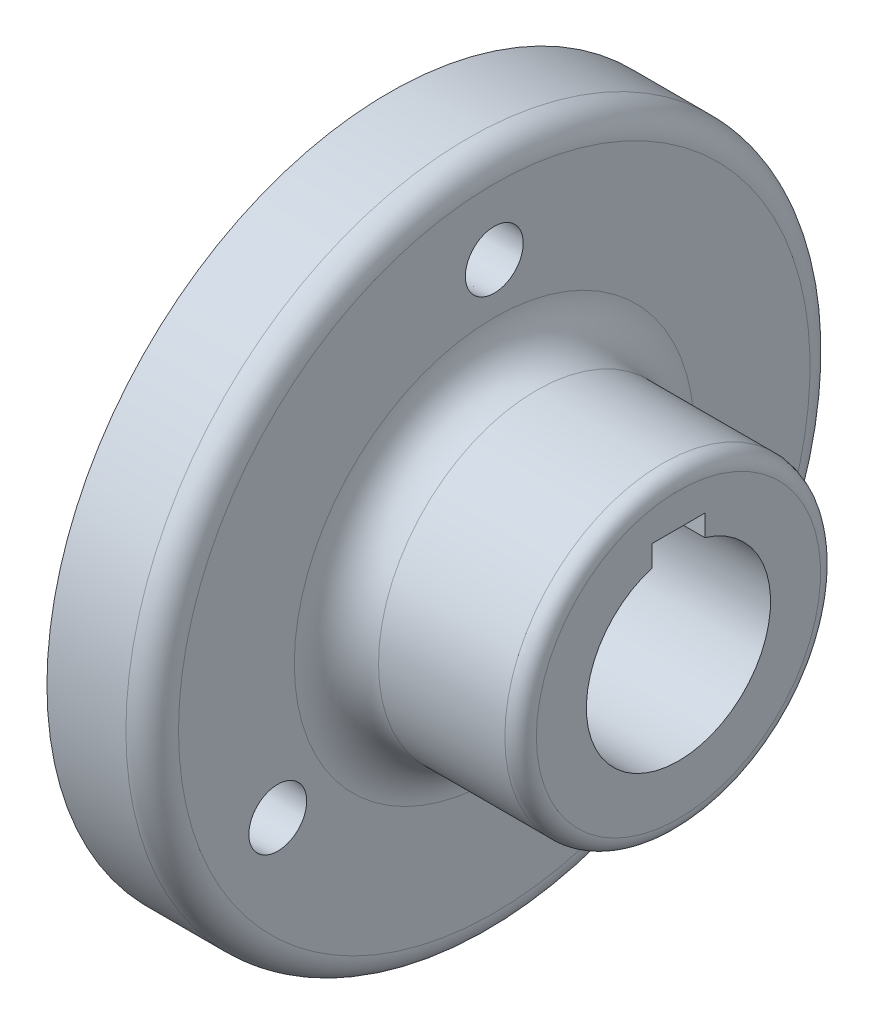
ISO-10303-21;
HEADER;
FILE_DESCRIPTION(('STEP AP214'),'2;1');
FILE_NAME('part.step','',(''),(''),'','','');
FILE_SCHEMA(('AUTOMOTIVE_DESIGN { 1 0 10303 214 1 1 1 1 }'));
ENDSEC;
DATA;
#1=APPLICATION_CONTEXT('core data for automotive mechanical design processes');
#2=APPLICATION_PROTOCOL_DEFINITION('international standard','automotive_design',2000,#1);
#3=PRODUCT_CONTEXT('',#1,'mechanical');
#4=PRODUCT('Part','Part','',(#3));
#5=PRODUCT_RELATED_PRODUCT_CATEGORY('part','',(#4));
#6=PRODUCT_DEFINITION_FORMATION('','',#4);
#7=PRODUCT_DEFINITION_CONTEXT('part definition',#1,'design');
#8=PRODUCT_DEFINITION('design','',#6,#7);
#9=PRODUCT_DEFINITION_SHAPE('','',#8);
#10=(LENGTH_UNIT() NAMED_UNIT(*) SI_UNIT(.MILLI.,.METRE.));
#11=(NAMED_UNIT(*) PLANE_ANGLE_UNIT() SI_UNIT($,.RADIAN.));
#12=(NAMED_UNIT(*) SI_UNIT($,.STERADIAN.) SOLID_ANGLE_UNIT());
#13=UNCERTAINTY_MEASURE_WITH_UNIT(LENGTH_MEASURE(1.E-05),#10,'distance_accuracy_value','');
#14=(GEOMETRIC_REPRESENTATION_CONTEXT(3) GLOBAL_UNCERTAINTY_ASSIGNED_CONTEXT((#13)) GLOBAL_UNIT_ASSIGNED_CONTEXT((#10,
#11,#12)) REPRESENTATION_CONTEXT('',''));
#15=CARTESIAN_POINT('',(0.,0.,0.));
#16=DIRECTION('',(0.,0.,1.));
#17=DIRECTION('',(1.,0.,0.));
#18=AXIS2_PLACEMENT_3D('',#15,#16,#17);
#19=CARTESIAN_POINT('',(-55.,0.,0.));
#20=DIRECTION('',(-1.,0.,0.));
#21=DIRECTION('',(0.,0.,1.));
#22=AXIS2_PLACEMENT_3D('',#19,#20,#21);
#23=CYLINDRICAL_SURFACE('',#22,65.);
#24=CARTESIAN_POINT('',(0.,0.,0.));
#25=DIRECTION('',(1.,0.,0.));
#26=DIRECTION('',(0.,0.,-1.));
#27=AXIS2_PLACEMENT_3D('',#24,#25,#26);
#28=CIRCLE('',#27,65.);
#29=CARTESIAN_POINT('',(0.,0.,-65.));
#30=VERTEX_POINT('',#29);
#31=EDGE_CURVE('E105',#30,#30,#28,.T.);
#32=ORIENTED_EDGE('',*,*,#31,.T.);
#33=EDGE_LOOP('',(#32));
#34=FACE_BOUND('',#33,.T.);
#35=CARTESIAN_POINT('',(15.,0.,0.));
#36=DIRECTION('',(-1.,0.,0.));
#37=DIRECTION('',(0.,0.,1.));
#38=AXIS2_PLACEMENT_3D('',#35,#36,#37);
#39=CIRCLE('',#38,65.);
#40=CARTESIAN_POINT('',(15.,0.,65.));
#41=VERTEX_POINT('',#40);
#42=EDGE_CURVE('E115',#41,#41,#39,.T.);
#43=ORIENTED_EDGE('',*,*,#42,.T.);
#44=EDGE_LOOP('',(#43));
#45=FACE_BOUND('',#44,.T.);
#46=ADVANCED_FACE('F36',(#34,#45),#23,.T.);
#47=CARTESIAN_POINT('',(0.,0.,0.));
#48=DIRECTION('',(-1.,0.,0.));
#49=DIRECTION('',(0.,0.,1.));
#50=AXIS2_PLACEMENT_3D('',#47,#48,#49);
#51=CYLINDRICAL_SURFACE('',#50,17.5);
#52=DIRECTION('',(-1.,0.,0.));
#53=VECTOR('',#52,1.);
#54=CARTESIAN_POINT('',(0.,16.7705098312484,-5.));
#55=LINE('',#54,#53);
#56=CARTESIAN_POINT('',(55.,16.7705098312484,-5.));
#57=VERTEX_POINT('',#56);
#58=CARTESIAN_POINT('',(0.,16.7705098312484,-5.));
#59=VERTEX_POINT('',#58);
#60=EDGE_CURVE('E11',#57,#59,#55,.T.);
#61=ORIENTED_EDGE('',*,*,#60,.T.);
#62=CARTESIAN_POINT('',(0.,0.,0.));
#63=DIRECTION('',(1.,0.,0.));
#64=DIRECTION('',(0.,0.,-1.));
#65=AXIS2_PLACEMENT_3D('',#62,#63,#64);
#66=CIRCLE('',#65,17.5);
#67=CARTESIAN_POINT('',(0.,16.7705098312484,5.));
#68=VERTEX_POINT('',#67);
#69=EDGE_CURVE('E156',#59,#68,#66,.F.);
#70=ORIENTED_EDGE('',*,*,#69,.T.);
#71=DIRECTION('',(-1.,0.,0.));
#72=VECTOR('',#71,1.);
#73=CARTESIAN_POINT('',(0.,16.7705098312484,5.));
#74=LINE('',#73,#72);
#75=CARTESIAN_POINT('',(55.,16.7705098312484,5.));
#76=VERTEX_POINT('',#75);
#77=EDGE_CURVE('E43',#68,#76,#74,.F.);
#78=ORIENTED_EDGE('',*,*,#77,.T.);
#79=CARTESIAN_POINT('',(55.,0.,0.));
#80=DIRECTION('',(-1.,0.,0.));
#81=DIRECTION('',(0.,0.,1.));
#82=AXIS2_PLACEMENT_3D('',#79,#80,#81);
#83=CIRCLE('',#82,17.5);
#84=EDGE_CURVE('E158',#57,#76,#83,.T.);
#85=ORIENTED_EDGE('',*,*,#84,.F.);
#86=EDGE_LOOP('',(#61,#70,#78,#85));
#87=FACE_BOUND('',#86,.T.);
#88=ADVANCED_FACE('F149',(#87),#51,.F.);
#89=CARTESIAN_POINT('',(-55.,14.2,-5.));
#90=DIRECTION('',(0.,0.,-1.));
#91=DIRECTION('',(-1.,0.,0.));
#92=AXIS2_PLACEMENT_3D('',#89,#90,#91);
#93=PLANE('',#92);
#94=DIRECTION('',(1.,0.,0.));
#95=VECTOR('',#94,1.);
#96=CARTESIAN_POINT('',(-55.,20.8,-5.));
#97=LINE('',#96,#95);
#98=CARTESIAN_POINT('',(0.,20.8,-5.));
#99=VERTEX_POINT('',#98);
#100=CARTESIAN_POINT('',(55.,20.8,-5.));
#101=VERTEX_POINT('',#100);
#102=EDGE_CURVE('E93',#99,#101,#97,.T.);
#103=ORIENTED_EDGE('',*,*,#102,.F.);
#104=DIRECTION('',(0.,-1.,0.));
#105=VECTOR('',#104,1.);
#106=CARTESIAN_POINT('',(0.,14.2,-5.));
#107=LINE('',#106,#105);
#108=EDGE_CURVE('E50',#99,#59,#107,.T.);
#109=ORIENTED_EDGE('',*,*,#108,.T.);
#110=ORIENTED_EDGE('',*,*,#60,.F.);
#111=DIRECTION('',(0.,1.,0.));
#112=VECTOR('',#111,1.);
#113=CARTESIAN_POINT('',(55.,14.2,-5.));
#114=LINE('',#113,#112);
#115=EDGE_CURVE('E161',#57,#101,#114,.T.);
#116=ORIENTED_EDGE('',*,*,#115,.T.);
#117=EDGE_LOOP('',(#103,#109,#110,#116));
#118=FACE_BOUND('',#117,.T.);
#119=ADVANCED_FACE('F145',(#118),#93,.F.);
#120=CARTESIAN_POINT('',(-55.,14.2,5.));
#121=DIRECTION('',(0.,0.,1.));
#122=DIRECTION('',(1.,0.,0.));
#123=AXIS2_PLACEMENT_3D('',#120,#121,#122);
#124=PLANE('',#123);
#125=ORIENTED_EDGE('',*,*,#77,.F.);
#126=DIRECTION('',(0.,1.,0.));
#127=VECTOR('',#126,1.);
#128=CARTESIAN_POINT('',(0.,14.2,5.));
#129=LINE('',#128,#127);
#130=CARTESIAN_POINT('',(0.,20.8,5.));
#131=VERTEX_POINT('',#130);
#132=EDGE_CURVE('E78',#68,#131,#129,.T.);
#133=ORIENTED_EDGE('',*,*,#132,.T.);
#134=DIRECTION('',(1.,0.,0.));
#135=VECTOR('',#134,1.);
#136=CARTESIAN_POINT('',(-55.,20.8,5.));
#137=LINE('',#136,#135);
#138=CARTESIAN_POINT('',(55.,20.8,5.));
#139=VERTEX_POINT('',#138);
#140=EDGE_CURVE('E86',#131,#139,#137,.T.);
#141=ORIENTED_EDGE('',*,*,#140,.T.);
#142=DIRECTION('',(0.,-1.,0.));
#143=VECTOR('',#142,1.);
#144=CARTESIAN_POINT('',(55.,14.2,5.));
#145=LINE('',#144,#143);
#146=EDGE_CURVE('E164',#139,#76,#145,.T.);
#147=ORIENTED_EDGE('',*,*,#146,.T.);
#148=EDGE_LOOP('',(#125,#133,#141,#147));
#149=FACE_BOUND('',#148,.T.);
#150=ADVANCED_FACE('F85',(#149),#124,.F.);
#151=CARTESIAN_POINT('',(-55.,20.8,5.));
#152=DIRECTION('',(0.,1.,0.));
#153=DIRECTION('',(0.,0.,1.));
#154=AXIS2_PLACEMENT_3D('',#151,#152,#153);
#155=PLANE('',#154);
#156=ORIENTED_EDGE('',*,*,#140,.F.);
#157=DIRECTION('',(0.,0.,-1.));
#158=VECTOR('',#157,1.);
#159=CARTESIAN_POINT('',(0.,20.8,5.));
#160=LINE('',#159,#158);
#161=EDGE_CURVE('E74',#131,#99,#160,.T.);
#162=ORIENTED_EDGE('',*,*,#161,.T.);
#163=ORIENTED_EDGE('',*,*,#102,.T.);
#164=DIRECTION('',(0.,0.,1.));
#165=VECTOR('',#164,1.);
#166=CARTESIAN_POINT('',(55.,20.8,5.));
#167=LINE('',#166,#165);
#168=EDGE_CURVE('E91',#101,#139,#167,.T.);
#169=ORIENTED_EDGE('',*,*,#168,.T.);
#170=EDGE_LOOP('',(#156,#162,#163,#169));
#171=FACE_BOUND('',#170,.T.);
#172=ADVANCED_FACE('F89',(#171),#155,.F.);
#173=CARTESIAN_POINT('',(55.,27.,0.));
#174=DIRECTION('',(-1.,0.,0.));
#175=DIRECTION('',(0.,0.,-1.));
#176=AXIS2_PLACEMENT_3D('',#173,#174,#175);
#177=PLANE('',#176);
#178=ORIENTED_EDGE('',*,*,#84,.T.);
#179=ORIENTED_EDGE('',*,*,#146,.F.);
#180=ORIENTED_EDGE('',*,*,#168,.F.);
#181=ORIENTED_EDGE('',*,*,#115,.F.);
#182=EDGE_LOOP('',(#178,#179,#180,#181));
#183=FACE_BOUND('',#182,.T.);
#184=CARTESIAN_POINT('',(55.,0.,0.));
#185=DIRECTION('',(-1.,0.,0.));
#186=DIRECTION('',(0.,0.,1.));
#187=AXIS2_PLACEMENT_3D('',#184,#185,#186);
#188=CIRCLE('',#187,27.);
#189=CARTESIAN_POINT('',(55.,0.,27.));
#190=VERTEX_POINT('',#189);
#191=EDGE_CURVE('E172',#190,#190,#188,.T.);
#192=ORIENTED_EDGE('',*,*,#191,.F.);
#193=EDGE_LOOP('',(#192));
#194=FACE_BOUND('',#193,.T.);
#195=ADVANCED_FACE('F138',(#183,#194),#177,.F.);
#196=CARTESIAN_POINT('',(15.,0.,0.));
#197=DIRECTION('',(1.,0.,0.));
#198=DIRECTION('',(0.,0.,1.));
#199=AXIS2_PLACEMENT_3D('',#196,#197,#198);
#200=TOROIDAL_SURFACE('',#199,60.,5.);
#201=CARTESIAN_POINT('',(20.,0.,0.));
#202=DIRECTION('',(-1.,0.,0.));
#203=DIRECTION('',(0.,0.,1.));
#204=AXIS2_PLACEMENT_3D('',#201,#202,#203);
#205=CIRCLE('',#204,60.);
#206=CARTESIAN_POINT('',(20.,0.,60.));
#207=VERTEX_POINT('',#206);
#208=EDGE_CURVE('E183',#207,#207,#205,.T.);
#209=ORIENTED_EDGE('',*,*,#208,.T.);
#210=EDGE_LOOP('',(#209));
#211=FACE_BOUND('',#210,.T.);
#212=ORIENTED_EDGE('',*,*,#42,.F.);
#213=EDGE_LOOP('',(#212));
#214=FACE_BOUND('',#213,.T.);
#215=ADVANCED_FACE('F134',(#211,#214),#200,.T.);
#216=CARTESIAN_POINT('',(20.,60.,0.));
#217=DIRECTION('',(-1.,0.,0.));
#218=DIRECTION('',(0.,0.,-1.));
#219=AXIS2_PLACEMENT_3D('',#216,#217,#218);
#220=PLANE('',#219);
#221=CARTESIAN_POINT('',(20.,-23.7500000000018,41.1362066797578));
#222=DIRECTION('',(1.,0.,0.));
#223=DIRECTION('',(0.,0.,-1.));
#224=AXIS2_PLACEMENT_3D('',#221,#222,#223);
#225=CIRCLE('',#224,5.50005382290806);
#226=CARTESIAN_POINT('',(20.,-23.7500000000018,35.6361528568497));
#227=VERTEX_POINT('',#226);
#228=EDGE_CURVE('E98',#227,#227,#225,.T.);
#229=ORIENTED_EDGE('',*,*,#228,.F.);
#230=EDGE_LOOP('',(#229));
#231=FACE_BOUND('',#230,.T.);
#232=CARTESIAN_POINT('',(20.,-23.7499999999982,-41.1362066797639));
#233=DIRECTION('',(1.,0.,0.));
#234=DIRECTION('',(0.,0.,-1.));
#235=AXIS2_PLACEMENT_3D('',#232,#233,#234);
#236=CIRCLE('',#235,5.50005382290684);
#237=CARTESIAN_POINT('',(20.,-23.7499999999982,-46.6362605026707));
#238=VERTEX_POINT('',#237);
#239=EDGE_CURVE('E102',#238,#238,#236,.T.);
#240=ORIENTED_EDGE('',*,*,#239,.F.);
#241=EDGE_LOOP('',(#240));
#242=FACE_BOUND('',#241,.T.);
#243=CARTESIAN_POINT('',(20.,47.5,0.));
#244=DIRECTION('',(1.,0.,0.));
#245=DIRECTION('',(0.,0.,-1.));
#246=AXIS2_PLACEMENT_3D('',#243,#244,#245);
#247=CIRCLE('',#246,5.50005382290423);
#248=CARTESIAN_POINT('',(20.,47.5,-5.50005382290423));
#249=VERTEX_POINT('',#248);
#250=EDGE_CURVE('E101',#249,#249,#247,.T.);
#251=ORIENTED_EDGE('',*,*,#250,.F.);
#252=EDGE_LOOP('',(#251));
#253=FACE_BOUND('',#252,.T.);
#254=CARTESIAN_POINT('',(20.,0.,0.));
#255=DIRECTION('',(-1.,0.,0.));
#256=DIRECTION('',(0.,0.,1.));
#257=AXIS2_PLACEMENT_3D('',#254,#255,#256);
#258=CIRCLE('',#257,38.);
#259=CARTESIAN_POINT('',(20.,0.,38.));
#260=VERTEX_POINT('',#259);
#261=EDGE_CURVE('E181',#260,#260,#258,.T.);
#262=ORIENTED_EDGE('',*,*,#261,.T.);
#263=EDGE_LOOP('',(#262));
#264=FACE_BOUND('',#263,.T.);
#265=ORIENTED_EDGE('',*,*,#208,.F.);
#266=EDGE_LOOP('',(#265));
#267=FACE_BOUND('',#266,.T.);
#268=ADVANCED_FACE('F130',(#231,#242,#253,#264,#267),#220,.F.);
#269=CARTESIAN_POINT('',(28.,0.,0.));
#270=DIRECTION('',(1.,0.,0.));
#271=DIRECTION('',(0.,0.,1.));
#272=AXIS2_PLACEMENT_3D('',#269,#270,#271);
#273=TOROIDAL_SURFACE('',#272,38.,8.);
#274=CARTESIAN_POINT('',(28.,0.,0.));
#275=DIRECTION('',(-1.,0.,0.));
#276=DIRECTION('',(0.,0.,1.));
#277=AXIS2_PLACEMENT_3D('',#274,#275,#276);
#278=CIRCLE('',#277,30.);
#279=CARTESIAN_POINT('',(28.,0.,30.));
#280=VERTEX_POINT('',#279);
#281=EDGE_CURVE('E178',#280,#280,#278,.T.);
#282=ORIENTED_EDGE('',*,*,#281,.T.);
#283=EDGE_LOOP('',(#282));
#284=FACE_BOUND('',#283,.T.);
#285=ORIENTED_EDGE('',*,*,#261,.F.);
#286=EDGE_LOOP('',(#285));
#287=FACE_BOUND('',#286,.T.);
#288=ADVANCED_FACE('F126',(#284,#287),#273,.F.);
#289=CARTESIAN_POINT('',(55.,0.,0.));
#290=DIRECTION('',(1.,0.,0.));
#291=DIRECTION('',(0.,0.,1.));
#292=AXIS2_PLACEMENT_3D('',#289,#290,#291);
#293=CYLINDRICAL_SURFACE('',#292,30.);
#294=CARTESIAN_POINT('',(40.2297724794524,-29.732137494637,-4.00000000000001));
#295=CARTESIAN_POINT('',(40.4533801903887,-29.7321408902408,-3.99999057189578));
#296=CARTESIAN_POINT('',(40.6771245456852,-29.7346872928155,-3.98118653408272));
#297=CARTESIAN_POINT('',(41.1183774041239,-29.7445929719378,-3.90647592532245));
#298=CARTESIAN_POINT('',(41.3358792892868,-29.7519571726567,-3.85053139298222));
#299=CARTESIAN_POINT('',(41.7581952159052,-29.7706498429081,-3.70322622280533));
#300=CARTESIAN_POINT('',(41.9630181026879,-29.7819755112418,-3.61189060550091));
#301=CARTESIAN_POINT('',(42.3543946308716,-29.8073116450363,-3.39645129761372));
#302=CARTESIAN_POINT('',(42.5409511973285,-29.8213216795734,-3.27235286526938));
#303=CARTESIAN_POINT('',(42.8917193887894,-29.8505475464148,-2.99406740979036));
#304=CARTESIAN_POINT('',(43.0557982108112,-29.8657697698747,-2.83971364549719));
#305=CARTESIAN_POINT('',(43.3558049703652,-29.8956475251647,-2.50565845745221));
#306=CARTESIAN_POINT('',(43.4917314624048,-29.9103030278649,-2.32595573294397));
#307=CARTESIAN_POINT('',(43.7320561628853,-29.9374619952073,-1.94546344985523));
#308=CARTESIAN_POINT('',(43.8363334580329,-29.9499571300455,-1.74459687542245));
#309=CARTESIAN_POINT('',(44.0096248078141,-29.9713170683162,-1.32800763207473));
#310=CARTESIAN_POINT('',(44.0786403442078,-29.9801820242919,-1.1122855878448));
#311=CARTESIAN_POINT('',(44.179050298613,-29.9932377239122,-0.673470750028178));
#312=CARTESIAN_POINT('',(44.2106661094764,-29.9974559641015,-0.450429446939794));
#313=CARTESIAN_POINT('',(44.2360656969261,-30.0008369594303,-0.00217000460731181));
#314=CARTESIAN_POINT('',(44.2298511549255,-29.9999999392566,0.223048037444933));
#315=CARTESIAN_POINT('',(44.1799430183706,-29.9933868823381,0.66776024893154));
#316=CARTESIAN_POINT('',(44.1364875499612,-29.9876422267562,0.887281674723571));
#317=CARTESIAN_POINT('',(44.0137038254094,-29.9718944818458,1.31588824542511));
#318=CARTESIAN_POINT('',(43.9343748091162,-29.9618913022807,1.52497316908368));
#319=CARTESIAN_POINT('',(43.7418455972088,-29.9386963800833,1.92750361684826));
#320=CARTESIAN_POINT('',(43.6285432330863,-29.9254950429176,2.12089969870652));
#321=CARTESIAN_POINT('',(43.3713579648867,-29.8973790083808,2.48602338146957));
#322=CARTESIAN_POINT('',(43.2274734661968,-29.8824642216858,2.65774985173364));
#323=CARTESIAN_POINT('',(42.9118767827346,-29.8524517619132,2.97606012309078));
#324=CARTESIAN_POINT('',(42.7399569430652,-29.837353568488,3.12243806706043));
#325=CARTESIAN_POINT('',(42.3738806167073,-29.8087899753847,3.38429386114383));
#326=CARTESIAN_POINT('',(42.1797240418465,-29.7953245821815,3.49977158872707));
#327=CARTESIAN_POINT('',(41.7744924787591,-29.7715515266868,3.69656572173001));
#328=CARTESIAN_POINT('',(41.5634086704155,-29.7612455242957,3.77786417813414));
#329=CARTESIAN_POINT('',(41.1304164381757,-29.7449895093144,3.90380180089849));
#330=CARTESIAN_POINT('',(40.9085086113993,-29.7390392567232,3.94844298708287));
#331=CARTESIAN_POINT('',(40.4619898094425,-29.7322129002069,3.99952321537455));
#332=CARTESIAN_POINT('',(40.2374126187874,-29.7312982302326,4.00625262197625));
#333=CARTESIAN_POINT('',(39.790333967243,-29.734544485934,3.98208576377592));
#334=CARTESIAN_POINT('',(39.5678324559735,-29.738705288095,3.95119041459553));
#335=CARTESIAN_POINT('',(39.1321005066412,-29.7515984087354,3.8528961007404));
#336=CARTESIAN_POINT('',(38.9188374934162,-29.760312955753,3.7856390064672));
#337=CARTESIAN_POINT('',(38.5066146525476,-29.7813171802881,3.61667690160251));
#338=CARTESIAN_POINT('',(38.307655392805,-29.7936069996568,3.51497052418766));
#339=CARTESIAN_POINT('',(37.9283778585708,-29.8204689323904,3.27928812834422));
#340=CARTESIAN_POINT('',(37.748178382716,-29.8350542757827,3.14512246332601));
#341=CARTESIAN_POINT('',(37.4127506025783,-29.8648228703302,2.84859664625598));
#342=CARTESIAN_POINT('',(37.2575234071564,-29.8800061479987,2.68623524287508));
#343=CARTESIAN_POINT('',(36.9754193716102,-29.9093789731066,2.33665509671648));
#344=CARTESIAN_POINT('',(36.8487338467092,-29.9235614009943,2.14928128186505));
#345=CARTESIAN_POINT('',(36.6286359151018,-29.9492268295661,1.75574490463524));
#346=CARTESIAN_POINT('',(36.5352227599402,-29.9607098909698,1.5495827650274));
#347=CARTESIAN_POINT('',(36.3846339562762,-29.9796512938231,1.12494554504687));
#348=CARTESIAN_POINT('',(36.3273496212853,-29.9871216964156,0.906509568494723));
#349=CARTESIAN_POINT('',(36.2502915085305,-29.9972463337324,0.463012986846395));
#350=CARTESIAN_POINT('',(36.230515794037,-29.9999008171227,0.237952724399643));
#351=CARTESIAN_POINT('',(36.2290759449718,-30.0000929449682,-0.210539747423174));
#352=CARTESIAN_POINT('',(36.2471175382636,-29.9976700982679,-0.433971051843747));
#353=CARTESIAN_POINT('',(36.3201745619164,-29.9880586643979,-0.874594886104723));
#354=CARTESIAN_POINT('',(36.3751899404952,-29.9808700839026,-1.09178742468215));
#355=CARTESIAN_POINT('',(36.5205365736057,-29.9625311328469,-1.51371646917767));
#356=CARTESIAN_POINT('',(36.6108517322681,-29.9513825681572,-1.71845860308763));
#357=CARTESIAN_POINT('',(36.8242035787443,-29.9263549879288,-2.10992815726196));
#358=CARTESIAN_POINT('',(36.9472408707589,-29.9124759219737,-2.29665524479908));
#359=CARTESIAN_POINT('',(37.2236258434581,-29.8834058241629,-2.64829457213272));
#360=CARTESIAN_POINT('',(37.3771920597249,-29.8682058058701,-2.81303431432518));
#361=CARTESIAN_POINT('',(37.7098186175531,-29.8382772980635,-3.11451791174715));
#362=CARTESIAN_POINT('',(37.8888849673172,-29.8235489206796,-3.25125515061516));
#363=CARTESIAN_POINT('',(38.2683403625753,-29.7961621972205,-3.49337581956155));
#364=CARTESIAN_POINT('',(38.4688196623964,-29.7835132334187,-3.59861880854683));
#365=CARTESIAN_POINT('',(38.88466941441,-29.7618273299481,-3.77379036559425));
#366=CARTESIAN_POINT('',(39.1000236189516,-29.7527865201032,-3.84375679331906));
#367=CARTESIAN_POINT('',(39.4686690369136,-29.7415026767313,-3.92990960757651));
#368=CARTESIAN_POINT('',(39.6196490253914,-29.7380085724299,-3.95615496271737));
#369=CARTESIAN_POINT('',(39.9236554983907,-29.7333248295038,-3.99120330686232));
#370=CARTESIAN_POINT('',(40.0766819642464,-29.7321351698749,-4.00000645484598));
#371=CARTESIAN_POINT('',(40.2297724794524,-29.732137494637,-4.00000000000001));
#372=B_SPLINE_CURVE_WITH_KNOTS('',3,(#294,#295,#296,#297,#298,#299,#300,#301,#302,#303,#304,
#305,#306,#307,#308,#309,#310,#311,#312,#313,#314,#315,#316,#317,#318,#319,#320,#321,#322,#323,
#324,#325,#326,#327,#328,#329,#330,#331,#332,#333,#334,#335,#336,#337,#338,#339,#340,#341,#342,
#343,#344,#345,#346,#347,#348,#349,#350,#351,#352,#353,#354,#355,#356,#357,#358,#359,#360,#361,
#362,#363,#364,#365,#366,#367,#368,#369,#370,#371),.UNSPECIFIED.,.T.,.F.,(4,2,2,2,2,2,2,2,2,2,2,
2,2,2,2,2,2,2,2,2,2,2,2,2,2,2,2,2,2,2,2,2,2,2,2,2,2,2,4),(0.,0.670263778500898,1.34121369221137,
2.0116901255365,2.68205901669913,3.35623190242331,4.03043939524477,4.70719113050294,
5.38391442513856,6.05661139049938,6.72927845729714,7.39767617339906,8.06608805333359,
8.73653056912504,9.40700805169258,10.0826983013792,10.7583912303818,11.4344385531148,
12.110448622982,12.7812740516386,13.4520831556709,14.1202936963719,14.7885307523642,
15.4607705628467,16.1330402150124,16.8096902352901,17.4863250335031,18.1609144754067,
18.835469084443,19.504794197126,20.1741183724129,20.8431377070039,21.5121693956216,
22.1861748473789,22.8603393681881,23.5374668396544,24.2138660462919,24.6727588189122,
25.1316474088673),.UNSPECIFIED.);
#373=CARTESIAN_POINT('',(40.2297724794524,-29.732137494637,-4.00000000000001));
#374=VERTEX_POINT('',#373);
#375=EDGE_CURVE('E95',#374,#374,#372,.T.);
#376=ORIENTED_EDGE('',*,*,#375,.F.);
#377=EDGE_LOOP('',(#376));
#378=FACE_BOUND('',#377,.T.);
#379=CARTESIAN_POINT('',(52.,0.,0.));
#380=DIRECTION('',(-1.,0.,0.));
#381=DIRECTION('',(0.,0.,1.));
#382=AXIS2_PLACEMENT_3D('',#379,#380,#381);
#383=CIRCLE('',#382,30.);
#384=CARTESIAN_POINT('',(52.,0.,30.));
#385=VERTEX_POINT('',#384);
#386=EDGE_CURVE('E175',#385,#385,#383,.T.);
#387=ORIENTED_EDGE('',*,*,#386,.T.);
#388=EDGE_LOOP('',(#387));
#389=FACE_BOUND('',#388,.T.);
#390=ORIENTED_EDGE('',*,*,#281,.F.);
#391=EDGE_LOOP('',(#390));
#392=FACE_BOUND('',#391,.T.);
#393=ADVANCED_FACE('F121',(#378,#389,#392),#293,.T.);
#394=CARTESIAN_POINT('',(52.,0.,0.));
#395=DIRECTION('',(1.,0.,0.));
#396=DIRECTION('',(0.,0.,1.));
#397=AXIS2_PLACEMENT_3D('',#394,#395,#396);
#398=TOROIDAL_SURFACE('',#397,27.,3.);
#399=ORIENTED_EDGE('',*,*,#191,.T.);
#400=EDGE_LOOP('',(#399));
#401=FACE_BOUND('',#400,.T.);
#402=ORIENTED_EDGE('',*,*,#386,.F.);
#403=EDGE_LOOP('',(#402));
#404=FACE_BOUND('',#403,.T.);
#405=ADVANCED_FACE('F125',(#401,#404),#398,.T.);
#406=CARTESIAN_POINT('',(40.2297724794524,-20.,0.));
#407=DIRECTION('',(0.,-1.,0.));
#408=DIRECTION('',(0.,0.,-1.));
#409=AXIS2_PLACEMENT_3D('',#406,#407,#408);
#410=CYLINDRICAL_SURFACE('',#409,4.00000000000001);
#411=CARTESIAN_POINT('',(40.2297724794524,-20.,0.));
#412=DIRECTION('',(0.,1.,0.));
#413=DIRECTION('',(0.,0.,-1.));
#414=AXIS2_PLACEMENT_3D('',#411,#412,#413);
#415=CIRCLE('',#414,4.00000000000001);
#416=CARTESIAN_POINT('',(40.2297724794524,-20.,-4.00000000000001));
#417=VERTEX_POINT('',#416);
#418=EDGE_CURVE('E108',#417,#417,#415,.T.);
#419=ORIENTED_EDGE('',*,*,#418,.T.);
#420=EDGE_LOOP('',(#419));
#421=FACE_BOUND('',#420,.T.);
#422=ORIENTED_EDGE('',*,*,#375,.T.);
#423=EDGE_LOOP('',(#422));
#424=FACE_BOUND('',#423,.T.);
#425=ADVANCED_FACE('F117',(#421,#424),#410,.F.);
#426=CARTESIAN_POINT('',(40.2297724794524,-20.,0.));
#427=DIRECTION('',(0.,-1.,0.));
#428=DIRECTION('',(0.,0.,-1.));
#429=AXIS2_PLACEMENT_3D('',#426,#427,#428);
#430=PLANE('',#429);
#431=ORIENTED_EDGE('',*,*,#418,.F.);
#432=EDGE_LOOP('',(#431));
#433=FACE_BOUND('',#432,.T.);
#434=ADVANCED_FACE('F204',(#433),#430,.T.);
#435=CARTESIAN_POINT('',(0.,47.5,0.));
#436=DIRECTION('',(-1.,0.,0.));
#437=DIRECTION('',(0.,0.,-1.));
#438=AXIS2_PLACEMENT_3D('',#435,#436,#437);
#439=CONICAL_SURFACE('',#438,7.,0.074857171618037);
#440=CARTESIAN_POINT('',(0.,47.5,0.));
#441=DIRECTION('',(1.,0.,0.));
#442=DIRECTION('',(0.,0.,-1.));
#443=AXIS2_PLACEMENT_3D('',#440,#441,#442);
#444=CIRCLE('',#443,7.);
#445=CARTESIAN_POINT('',(0.,47.5,-7.));
#446=VERTEX_POINT('',#445);
#447=EDGE_CURVE('E82',#446,#446,#444,.F.);
#448=ORIENTED_EDGE('',*,*,#447,.T.);
#449=EDGE_LOOP('',(#448));
#450=FACE_BOUND('',#449,.T.);
#451=ORIENTED_EDGE('',*,*,#250,.T.);
#452=EDGE_LOOP('',(#451));
#453=FACE_BOUND('',#452,.T.);
#454=ADVANCED_FACE('F210',(#450,#453),#439,.F.);
#455=CARTESIAN_POINT('',(0.,-23.7499999999982,-41.1362066797639));
#456=DIRECTION('',(-1.,0.,0.));
#457=DIRECTION('',(0.,0.,-1.));
#458=AXIS2_PLACEMENT_3D('',#455,#456,#457);
#459=CONICAL_SURFACE('',#458,7.00000000000261,0.074857171618037);
#460=CARTESIAN_POINT('',(0.,-23.7499999999982,-41.1362066797639));
#461=DIRECTION('',(1.,0.,0.));
#462=DIRECTION('',(0.,0.,-1.));
#463=AXIS2_PLACEMENT_3D('',#460,#461,#462);
#464=CIRCLE('',#463,7.00000000000261);
#465=CARTESIAN_POINT('',(0.,-23.7499999999982,-48.1362066797665));
#466=VERTEX_POINT('',#465);
#467=EDGE_CURVE('E353',#466,#466,#464,.F.);
#468=ORIENTED_EDGE('',*,*,#467,.T.);
#469=EDGE_LOOP('',(#468));
#470=FACE_BOUND('',#469,.T.);
#471=ORIENTED_EDGE('',*,*,#239,.T.);
#472=EDGE_LOOP('',(#471));
#473=FACE_BOUND('',#472,.T.);
#474=ADVANCED_FACE('F218',(#470,#473),#459,.F.);
#475=CARTESIAN_POINT('',(0.,-23.7500000000018,41.1362066797578));
#476=DIRECTION('',(-1.,0.,0.));
#477=DIRECTION('',(0.,0.,-1.));
#478=AXIS2_PLACEMENT_3D('',#475,#476,#477);
#479=CONICAL_SURFACE('',#478,7.00000000000384,0.074857171618037);
#480=CARTESIAN_POINT('',(0.,-23.7500000000018,41.1362066797578));
#481=DIRECTION('',(1.,0.,0.));
#482=DIRECTION('',(0.,0.,-1.));
#483=AXIS2_PLACEMENT_3D('',#480,#481,#482);
#484=CIRCLE('',#483,7.00000000000384);
#485=CARTESIAN_POINT('',(0.,-23.7500000000018,34.136206679754));
#486=VERTEX_POINT('',#485);
#487=EDGE_CURVE('E344',#486,#486,#484,.F.);
#488=ORIENTED_EDGE('',*,*,#487,.T.);
#489=EDGE_LOOP('',(#488));
#490=FACE_BOUND('',#489,.T.);
#491=ORIENTED_EDGE('',*,*,#228,.T.);
#492=EDGE_LOOP('',(#491));
#493=FACE_BOUND('',#492,.T.);
#494=ADVANCED_FACE('F224',(#490,#493),#479,.F.);
#495=CARTESIAN_POINT('',(0.,0.,0.));
#496=DIRECTION('',(1.,0.,0.));
#497=DIRECTION('',(0.,0.,-1.));
#498=AXIS2_PLACEMENT_3D('',#495,#496,#497);
#499=PLANE('',#498);
#500=ORIENTED_EDGE('',*,*,#108,.F.);
#501=ORIENTED_EDGE('',*,*,#161,.F.);
#502=ORIENTED_EDGE('',*,*,#132,.F.);
#503=ORIENTED_EDGE('',*,*,#69,.F.);
#504=EDGE_LOOP('',(#500,#501,#502,#503));
#505=FACE_BOUND('',#504,.T.);
#506=ORIENTED_EDGE('',*,*,#447,.F.);
#507=EDGE_LOOP('',(#506));
#508=FACE_BOUND('',#507,.T.);
#509=ORIENTED_EDGE('',*,*,#487,.F.);
#510=EDGE_LOOP('',(#509));
#511=FACE_BOUND('',#510,.T.);
#512=ORIENTED_EDGE('',*,*,#467,.F.);
#513=EDGE_LOOP('',(#512));
#514=FACE_BOUND('',#513,.T.);
#515=ORIENTED_EDGE('',*,*,#31,.F.);
#516=EDGE_LOOP('',(#515));
#517=FACE_BOUND('',#516,.T.);
#518=ADVANCED_FACE('F76',(#505,#508,#511,#514,#517),#499,.F.);
#519=CLOSED_SHELL('',(#46,#88,#119,#150,#172,#195,#215,#268,#288,#393,#405,#425,#434,#454,#474,
#494,#518));
#520=MANIFOLD_SOLID_BREP('B2',#519);
#521=ADVANCED_BREP_SHAPE_REPRESENTATION('',(#18,#520),#14);
#522=SHAPE_DEFINITION_REPRESENTATION(#9,#521);
ENDSEC;
END-ISO-10303-21;
